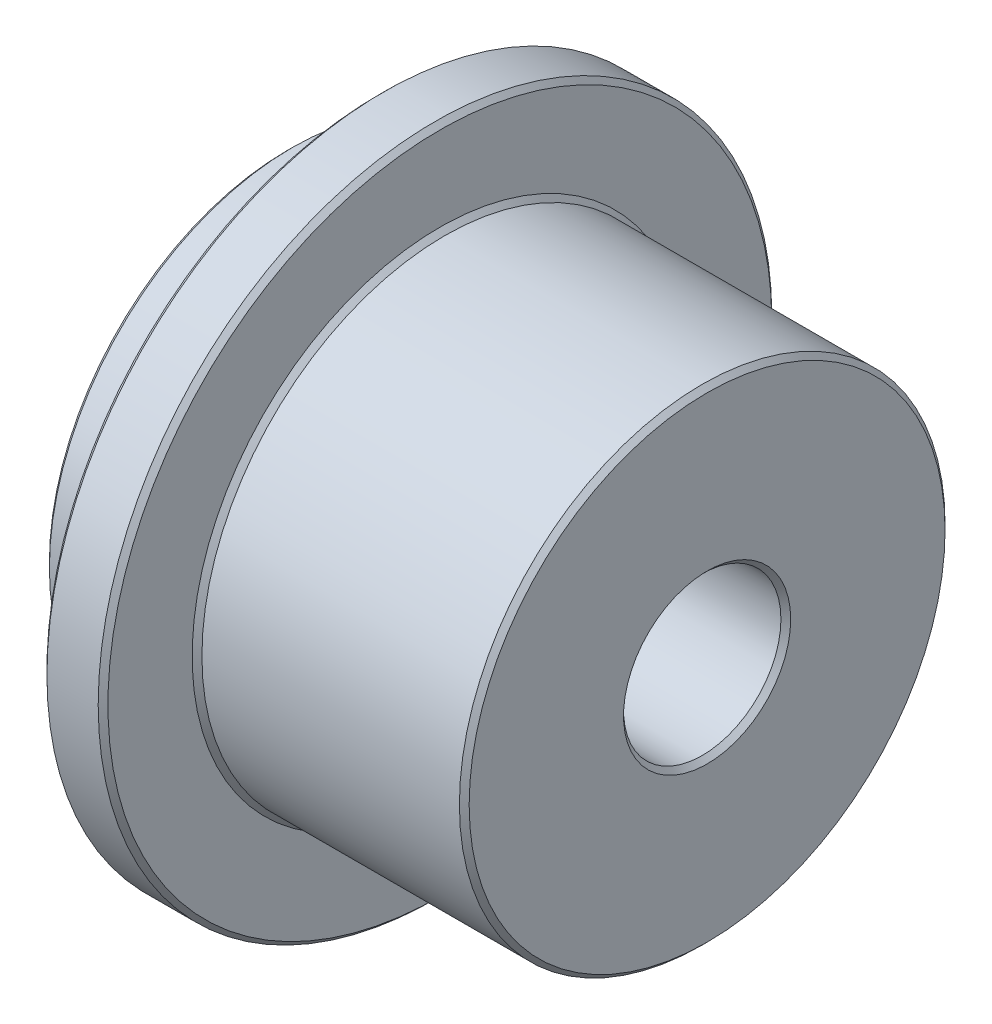
ISO-10303-21;
HEADER;
FILE_DESCRIPTION(('STEP AP214'),'2;1');
FILE_NAME('part.step','',(''),(''),'','','');
FILE_SCHEMA(('AUTOMOTIVE_DESIGN { 1 0 10303 214 1 1 1 1 }'));
ENDSEC;
DATA;
#1=APPLICATION_CONTEXT('core data for automotive mechanical design processes');
#2=APPLICATION_PROTOCOL_DEFINITION('international standard','automotive_design',2000,#1);
#3=PRODUCT_CONTEXT('',#1,'mechanical');
#4=PRODUCT('Part','Part','',(#3));
#5=PRODUCT_RELATED_PRODUCT_CATEGORY('part','',(#4));
#6=PRODUCT_DEFINITION_FORMATION('','',#4);
#7=PRODUCT_DEFINITION_CONTEXT('part definition',#1,'design');
#8=PRODUCT_DEFINITION('design','',#6,#7);
#9=PRODUCT_DEFINITION_SHAPE('','',#8);
#10=(LENGTH_UNIT() NAMED_UNIT(*) SI_UNIT(.MILLI.,.METRE.));
#11=(NAMED_UNIT(*) PLANE_ANGLE_UNIT() SI_UNIT($,.RADIAN.));
#12=(NAMED_UNIT(*) SI_UNIT($,.STERADIAN.) SOLID_ANGLE_UNIT());
#13=UNCERTAINTY_MEASURE_WITH_UNIT(LENGTH_MEASURE(1.E-05),#10,'distance_accuracy_value','');
#14=(GEOMETRIC_REPRESENTATION_CONTEXT(3) GLOBAL_UNCERTAINTY_ASSIGNED_CONTEXT((#13)) GLOBAL_UNIT_ASSIGNED_CONTEXT((#10,
#11,#12)) REPRESENTATION_CONTEXT('',''));
#15=CARTESIAN_POINT('',(0.,0.,0.));
#16=DIRECTION('',(0.,0.,1.));
#17=DIRECTION('',(1.,0.,0.));
#18=AXIS2_PLACEMENT_3D('',#15,#16,#17);
#19=CARTESIAN_POINT('',(21.844,0.,0.));
#20=DIRECTION('',(-1.,0.,0.));
#21=DIRECTION('',(0.,0.,1.));
#22=AXIS2_PLACEMENT_3D('',#19,#20,#21);
#23=CYLINDRICAL_SURFACE('',#22,12.6365);
#24=CARTESIAN_POINT('',(4.50849999999999,0.,0.));
#25=DIRECTION('',(1.,0.,0.));
#26=DIRECTION('',(0.,0.,-1.));
#27=AXIS2_PLACEMENT_3D('',#24,#25,#26);
#28=CIRCLE('',#27,12.6365);
#29=CARTESIAN_POINT('',(4.50849999999999,0.,-12.6365));
#30=VERTEX_POINT('',#29);
#31=EDGE_CURVE('E93',#30,#30,#28,.F.);
#32=ORIENTED_EDGE('',*,*,#31,.T.);
#33=EDGE_LOOP('',(#32));
#34=FACE_BOUND('',#33,.T.);
#35=CARTESIAN_POINT('',(0.254000000000008,0.,0.));
#36=DIRECTION('',(1.,0.,0.));
#37=DIRECTION('',(0.,0.,-1.));
#38=AXIS2_PLACEMENT_3D('',#35,#36,#37);
#39=CIRCLE('',#38,12.6365);
#40=CARTESIAN_POINT('',(0.254000000000008,0.,-12.6365));
#41=VERTEX_POINT('',#40);
#42=EDGE_CURVE('E97',#41,#41,#39,.T.);
#43=ORIENTED_EDGE('',*,*,#42,.T.);
#44=EDGE_LOOP('',(#43));
#45=FACE_BOUND('',#44,.T.);
#46=ADVANCED_FACE('F37',(#34,#45),#23,.T.);
#47=CARTESIAN_POINT('',(0.,0.,0.));
#48=DIRECTION('',(1.,0.,0.));
#49=DIRECTION('',(0.,0.,-1.));
#50=AXIS2_PLACEMENT_3D('',#47,#48,#49);
#51=PLANE('',#50);
#52=CARTESIAN_POINT('',(0.,0.,0.));
#53=DIRECTION('',(1.,0.,0.));
#54=DIRECTION('',(0.,0.,-1.));
#55=AXIS2_PLACEMENT_3D('',#52,#53,#54);
#56=CIRCLE('',#55,4.34975);
#57=CARTESIAN_POINT('',(0.,0.,-4.34975));
#58=VERTEX_POINT('',#57);
#59=EDGE_CURVE('E55',#58,#58,#56,.T.);
#60=ORIENTED_EDGE('',*,*,#59,.T.);
#61=EDGE_LOOP('',(#60));
#62=FACE_BOUND('',#61,.T.);
#63=CARTESIAN_POINT('',(0.,0.,0.));
#64=DIRECTION('',(1.,0.,0.));
#65=DIRECTION('',(0.,0.,-1.));
#66=AXIS2_PLACEMENT_3D('',#63,#64,#65);
#67=CIRCLE('',#66,12.3825);
#68=CARTESIAN_POINT('',(0.,0.,-12.3825));
#69=VERTEX_POINT('',#68);
#70=EDGE_CURVE('E61',#69,#69,#67,.F.);
#71=ORIENTED_EDGE('',*,*,#70,.T.);
#72=EDGE_LOOP('',(#71));
#73=FACE_BOUND('',#72,.T.);
#74=ADVANCED_FACE('F123',(#62,#73),#51,.F.);
#75=CARTESIAN_POINT('',(4.7625,0.,0.));
#76=DIRECTION('',(1.,0.,0.));
#77=DIRECTION('',(0.,0.,-1.));
#78=AXIS2_PLACEMENT_3D('',#75,#76,#77);
#79=CYLINDRICAL_SURFACE('',#78,17.526);
#80=CARTESIAN_POINT('',(5.0165,0.,0.));
#81=DIRECTION('',(1.,0.,0.));
#82=DIRECTION('',(0.,0.,-1.));
#83=AXIS2_PLACEMENT_3D('',#80,#81,#82);
#84=CIRCLE('',#83,17.526);
#85=CARTESIAN_POINT('',(5.0165,0.,-17.526));
#86=VERTEX_POINT('',#85);
#87=EDGE_CURVE('E85',#86,#86,#84,.T.);
#88=ORIENTED_EDGE('',*,*,#87,.T.);
#89=EDGE_LOOP('',(#88));
#90=FACE_BOUND('',#89,.T.);
#91=CARTESIAN_POINT('',(7.68350000000001,0.,0.));
#92=DIRECTION('',(1.,0.,0.));
#93=DIRECTION('',(0.,0.,-1.));
#94=AXIS2_PLACEMENT_3D('',#91,#92,#93);
#95=CIRCLE('',#94,17.526);
#96=CARTESIAN_POINT('',(7.68350000000001,0.,-17.526));
#97=VERTEX_POINT('',#96);
#98=EDGE_CURVE('E89',#97,#97,#95,.F.);
#99=ORIENTED_EDGE('',*,*,#98,.T.);
#100=EDGE_LOOP('',(#99));
#101=FACE_BOUND('',#100,.T.);
#102=ADVANCED_FACE('F120',(#90,#101),#79,.T.);
#103=CARTESIAN_POINT('',(4.7625,0.,0.));
#104=DIRECTION('',(1.,0.,0.));
#105=DIRECTION('',(0.,0.,-1.));
#106=AXIS2_PLACEMENT_3D('',#103,#104,#105);
#107=PLANE('',#106);
#108=CARTESIAN_POINT('',(4.7625,0.,0.));
#109=DIRECTION('',(1.,0.,0.));
#110=DIRECTION('',(0.,0.,-1.));
#111=AXIS2_PLACEMENT_3D('',#108,#109,#110);
#112=CIRCLE('',#111,12.8905);
#113=CARTESIAN_POINT('',(4.7625,0.,-12.8905));
#114=VERTEX_POINT('',#113);
#115=EDGE_CURVE('E101',#114,#114,#112,.T.);
#116=ORIENTED_EDGE('',*,*,#115,.T.);
#117=EDGE_LOOP('',(#116));
#118=FACE_BOUND('',#117,.T.);
#119=CARTESIAN_POINT('',(4.7625,0.,0.));
#120=DIRECTION('',(1.,0.,0.));
#121=DIRECTION('',(0.,0.,-1.));
#122=AXIS2_PLACEMENT_3D('',#119,#120,#121);
#123=CIRCLE('',#122,17.272);
#124=CARTESIAN_POINT('',(4.7625,0.,-17.272));
#125=VERTEX_POINT('',#124);
#126=EDGE_CURVE('E105',#125,#125,#123,.F.);
#127=ORIENTED_EDGE('',*,*,#126,.T.);
#128=EDGE_LOOP('',(#127));
#129=FACE_BOUND('',#128,.T.);
#130=ADVANCED_FACE('F110',(#118,#129),#107,.F.);
#131=CARTESIAN_POINT('',(7.9375,0.,0.));
#132=DIRECTION('',(1.,0.,0.));
#133=DIRECTION('',(0.,0.,-1.));
#134=AXIS2_PLACEMENT_3D('',#131,#132,#133);
#135=PLANE('',#134);
#136=CARTESIAN_POINT('',(7.9375,0.,0.));
#137=DIRECTION('',(1.,0.,0.));
#138=DIRECTION('',(0.,0.,-1.));
#139=AXIS2_PLACEMENT_3D('',#136,#137,#138);
#140=CIRCLE('',#139,17.272);
#141=CARTESIAN_POINT('',(7.9375,0.,-17.272));
#142=VERTEX_POINT('',#141);
#143=EDGE_CURVE('E77',#142,#142,#140,.T.);
#144=ORIENTED_EDGE('',*,*,#143,.T.);
#145=EDGE_LOOP('',(#144));
#146=FACE_BOUND('',#145,.T.);
#147=CARTESIAN_POINT('',(7.9375,0.,0.));
#148=DIRECTION('',(1.,0.,0.));
#149=DIRECTION('',(0.,0.,-1.));
#150=AXIS2_PLACEMENT_3D('',#147,#148,#149);
#151=CIRCLE('',#150,12.8905);
#152=CARTESIAN_POINT('',(7.9375,0.,-12.8905));
#153=VERTEX_POINT('',#152);
#154=EDGE_CURVE('E81',#153,#153,#151,.F.);
#155=ORIENTED_EDGE('',*,*,#154,.T.);
#156=EDGE_LOOP('',(#155));
#157=FACE_BOUND('',#156,.T.);
#158=ADVANCED_FACE('F133',(#146,#157),#135,.T.);
#159=CARTESIAN_POINT('',(21.844,0.,0.));
#160=DIRECTION('',(1.,0.,0.));
#161=DIRECTION('',(0.,0.,-1.));
#162=AXIS2_PLACEMENT_3D('',#159,#160,#161);
#163=PLANE('',#162);
#164=CARTESIAN_POINT('',(21.844,0.,0.));
#165=DIRECTION('',(1.,0.,0.));
#166=DIRECTION('',(0.,0.,-1.));
#167=AXIS2_PLACEMENT_3D('',#164,#165,#166);
#168=CIRCLE('',#167,4.34975);
#169=CARTESIAN_POINT('',(21.844,0.,-4.34975));
#170=VERTEX_POINT('',#169);
#171=EDGE_CURVE('E10',#170,#170,#168,.F.);
#172=ORIENTED_EDGE('',*,*,#171,.T.);
#173=EDGE_LOOP('',(#172));
#174=FACE_BOUND('',#173,.T.);
#175=CARTESIAN_POINT('',(21.844,0.,0.));
#176=DIRECTION('',(1.,0.,0.));
#177=DIRECTION('',(0.,0.,-1.));
#178=AXIS2_PLACEMENT_3D('',#175,#176,#177);
#179=CIRCLE('',#178,12.3825);
#180=CARTESIAN_POINT('',(21.844,0.,-12.3825));
#181=VERTEX_POINT('',#180);
#182=EDGE_CURVE('E73',#181,#181,#179,.T.);
#183=ORIENTED_EDGE('',*,*,#182,.T.);
#184=EDGE_LOOP('',(#183));
#185=FACE_BOUND('',#184,.T.);
#186=ADVANCED_FACE('F136',(#174,#185),#163,.T.);
#187=CARTESIAN_POINT('',(21.59,0.,0.));
#188=DIRECTION('',(1.,0.,0.));
#189=DIRECTION('',(0.,0.,-1.));
#190=AXIS2_PLACEMENT_3D('',#187,#188,#189);
#191=CIRCLE('',#190,12.6365);
#192=CARTESIAN_POINT('',(21.59,0.,-12.6365));
#193=VERTEX_POINT('',#192);
#194=EDGE_CURVE('E65',#193,#193,#191,.F.);
#195=ORIENTED_EDGE('',*,*,#194,.T.);
#196=EDGE_LOOP('',(#195));
#197=FACE_BOUND('',#196,.T.);
#198=CARTESIAN_POINT('',(8.19150000000001,0.,0.));
#199=DIRECTION('',(1.,0.,0.));
#200=DIRECTION('',(0.,0.,-1.));
#201=AXIS2_PLACEMENT_3D('',#198,#199,#200);
#202=CIRCLE('',#201,12.6365);
#203=CARTESIAN_POINT('',(8.19150000000001,0.,-12.6365));
#204=VERTEX_POINT('',#203);
#205=EDGE_CURVE('E69',#204,#204,#202,.T.);
#206=ORIENTED_EDGE('',*,*,#205,.T.);
#207=EDGE_LOOP('',(#206));
#208=FACE_BOUND('',#207,.T.);
#209=ADVANCED_FACE('F148',(#197,#208),#23,.T.);
#210=CARTESIAN_POINT('',(4.7625,0.,0.));
#211=DIRECTION('',(1.,0.,0.));
#212=DIRECTION('',(0.,0.,-1.));
#213=AXIS2_PLACEMENT_3D('',#210,#211,#212);
#214=CONICAL_SURFACE('',#213,12.8905,0.785398163397452);
#215=ORIENTED_EDGE('',*,*,#31,.F.);
#216=EDGE_LOOP('',(#215));
#217=FACE_BOUND('',#216,.T.);
#218=ORIENTED_EDGE('',*,*,#115,.F.);
#219=EDGE_LOOP('',(#218));
#220=FACE_BOUND('',#219,.T.);
#221=ADVANCED_FACE('F116',(#217,#220),#214,.T.);
#222=CARTESIAN_POINT('',(5.0165,0.,0.));
#223=DIRECTION('',(1.,0.,0.));
#224=DIRECTION('',(0.,0.,-1.));
#225=AXIS2_PLACEMENT_3D('',#222,#223,#224);
#226=CONICAL_SURFACE('',#225,17.526,0.785398163397448);
#227=ORIENTED_EDGE('',*,*,#126,.F.);
#228=EDGE_LOOP('',(#227));
#229=FACE_BOUND('',#228,.T.);
#230=ORIENTED_EDGE('',*,*,#87,.F.);
#231=EDGE_LOOP('',(#230));
#232=FACE_BOUND('',#231,.T.);
#233=ADVANCED_FACE('F112',(#229,#232),#226,.T.);
#234=CARTESIAN_POINT('',(7.9375,0.,0.));
#235=DIRECTION('',(-1.,0.,0.));
#236=DIRECTION('',(0.,0.,1.));
#237=AXIS2_PLACEMENT_3D('',#234,#235,#236);
#238=CONICAL_SURFACE('',#237,17.272,0.785398163397442);
#239=ORIENTED_EDGE('',*,*,#98,.F.);
#240=EDGE_LOOP('',(#239));
#241=FACE_BOUND('',#240,.T.);
#242=ORIENTED_EDGE('',*,*,#143,.F.);
#243=EDGE_LOOP('',(#242));
#244=FACE_BOUND('',#243,.T.);
#245=ADVANCED_FACE('F115',(#241,#244),#238,.T.);
#246=CARTESIAN_POINT('',(21.844,0.,0.));
#247=DIRECTION('',(-1.,0.,0.));
#248=DIRECTION('',(0.,0.,1.));
#249=AXIS2_PLACEMENT_3D('',#246,#247,#248);
#250=CONICAL_SURFACE('',#249,12.3825,0.785398163397458);
#251=ORIENTED_EDGE('',*,*,#194,.F.);
#252=EDGE_LOOP('',(#251));
#253=FACE_BOUND('',#252,.T.);
#254=ORIENTED_EDGE('',*,*,#182,.F.);
#255=EDGE_LOOP('',(#254));
#256=FACE_BOUND('',#255,.T.);
#257=ADVANCED_FACE('F129',(#253,#256),#250,.T.);
#258=CARTESIAN_POINT('',(0.254000000000008,0.,0.));
#259=DIRECTION('',(1.,0.,0.));
#260=DIRECTION('',(0.,0.,-1.));
#261=AXIS2_PLACEMENT_3D('',#258,#259,#260);
#262=CONICAL_SURFACE('',#261,12.6365,0.785398163397452);
#263=ORIENTED_EDGE('',*,*,#70,.F.);
#264=EDGE_LOOP('',(#263));
#265=FACE_BOUND('',#264,.T.);
#266=ORIENTED_EDGE('',*,*,#42,.F.);
#267=EDGE_LOOP('',(#266));
#268=FACE_BOUND('',#267,.T.);
#269=ADVANCED_FACE('F144',(#265,#268),#262,.T.);
#270=CARTESIAN_POINT('',(8.19150000000001,0.,0.));
#271=DIRECTION('',(-1.,0.,0.));
#272=DIRECTION('',(0.,0.,1.));
#273=AXIS2_PLACEMENT_3D('',#270,#271,#272);
#274=CONICAL_SURFACE('',#273,12.6365,0.785398163397445);
#275=ORIENTED_EDGE('',*,*,#154,.F.);
#276=EDGE_LOOP('',(#275));
#277=FACE_BOUND('',#276,.T.);
#278=ORIENTED_EDGE('',*,*,#205,.F.);
#279=EDGE_LOOP('',(#278));
#280=FACE_BOUND('',#279,.T.);
#281=ADVANCED_FACE('F140',(#277,#280),#274,.T.);
#282=CARTESIAN_POINT('',(0.,0.,0.));
#283=DIRECTION('',(1.,0.,0.));
#284=DIRECTION('',(0.,0.,-1.));
#285=AXIS2_PLACEMENT_3D('',#282,#283,#284);
#286=CYLINDRICAL_SURFACE('',#285,4.09575);
#287=CARTESIAN_POINT('',(0.254,0.,0.));
#288=DIRECTION('',(1.,0.,0.));
#289=DIRECTION('',(0.,0.,-1.));
#290=AXIS2_PLACEMENT_3D('',#287,#288,#289);
#291=CIRCLE('',#290,4.09575);
#292=CARTESIAN_POINT('',(0.254,0.,-4.09575));
#293=VERTEX_POINT('',#292);
#294=EDGE_CURVE('E45',#293,#293,#291,.F.);
#295=ORIENTED_EDGE('',*,*,#294,.T.);
#296=EDGE_LOOP('',(#295));
#297=FACE_BOUND('',#296,.T.);
#298=CARTESIAN_POINT('',(21.59,0.,0.));
#299=DIRECTION('',(1.,0.,0.));
#300=DIRECTION('',(0.,0.,-1.));
#301=AXIS2_PLACEMENT_3D('',#298,#299,#300);
#302=CIRCLE('',#301,4.09575);
#303=CARTESIAN_POINT('',(21.59,0.,-4.09575));
#304=VERTEX_POINT('',#303);
#305=EDGE_CURVE('E50',#304,#304,#302,.T.);
#306=ORIENTED_EDGE('',*,*,#305,.T.);
#307=EDGE_LOOP('',(#306));
#308=FACE_BOUND('',#307,.T.);
#309=ADVANCED_FACE('F143',(#297,#308),#286,.F.);
#310=CARTESIAN_POINT('',(0.,0.,0.));
#311=DIRECTION('',(-1.,0.,0.));
#312=DIRECTION('',(0.,0.,1.));
#313=AXIS2_PLACEMENT_3D('',#310,#311,#312);
#314=CONICAL_SURFACE('',#313,4.34975,0.785398163397448);
#315=ORIENTED_EDGE('',*,*,#294,.F.);
#316=EDGE_LOOP('',(#315));
#317=FACE_BOUND('',#316,.T.);
#318=ORIENTED_EDGE('',*,*,#59,.F.);
#319=EDGE_LOOP('',(#318));
#320=FACE_BOUND('',#319,.T.);
#321=ADVANCED_FACE('F179',(#317,#320),#314,.F.);
#322=CARTESIAN_POINT('',(21.59,0.,0.));
#323=DIRECTION('',(1.,0.,0.));
#324=DIRECTION('',(0.,0.,-1.));
#325=AXIS2_PLACEMENT_3D('',#322,#323,#324);
#326=CONICAL_SURFACE('',#325,4.09575,0.785398163397447);
#327=ORIENTED_EDGE('',*,*,#171,.F.);
#328=EDGE_LOOP('',(#327));
#329=FACE_BOUND('',#328,.T.);
#330=ORIENTED_EDGE('',*,*,#305,.F.);
#331=EDGE_LOOP('',(#330));
#332=FACE_BOUND('',#331,.T.);
#333=ADVANCED_FACE('F39',(#329,#332),#326,.F.);
#334=CLOSED_SHELL('',(#46,#74,#102,#130,#158,#186,#209,#221,#233,#245,#257,#269,#281,#309,#321,#333));
#335=MANIFOLD_SOLID_BREP('B2',#334);
#336=ADVANCED_BREP_SHAPE_REPRESENTATION('',(#18,#335),#14);
#337=SHAPE_DEFINITION_REPRESENTATION(#9,#336);
ENDSEC;
END-ISO-10303-21;
